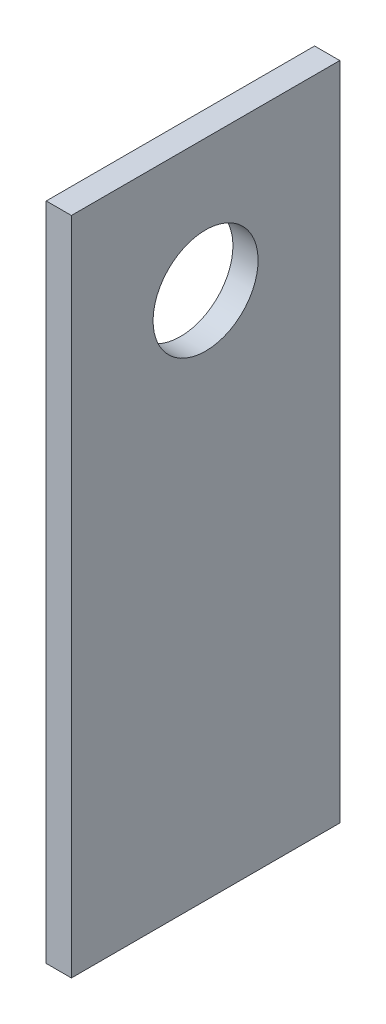
ISO-10303-21;
HEADER;
FILE_DESCRIPTION(('STEP AP214'),'2;1');
FILE_NAME('part.step','',(''),(''),'','','');
FILE_SCHEMA(('AUTOMOTIVE_DESIGN { 1 0 10303 214 1 1 1 1 }'));
ENDSEC;
DATA;
#1=APPLICATION_CONTEXT('core data for automotive mechanical design processes');
#2=APPLICATION_PROTOCOL_DEFINITION('international standard','automotive_design',2000,#1);
#3=PRODUCT_CONTEXT('',#1,'mechanical');
#4=PRODUCT('Part','Part','',(#3));
#5=PRODUCT_RELATED_PRODUCT_CATEGORY('part','',(#4));
#6=PRODUCT_DEFINITION_FORMATION('','',#4);
#7=PRODUCT_DEFINITION_CONTEXT('part definition',#1,'design');
#8=PRODUCT_DEFINITION('design','',#6,#7);
#9=PRODUCT_DEFINITION_SHAPE('','',#8);
#10=(LENGTH_UNIT() NAMED_UNIT(*) SI_UNIT(.MILLI.,.METRE.));
#11=(NAMED_UNIT(*) PLANE_ANGLE_UNIT() SI_UNIT($,.RADIAN.));
#12=(NAMED_UNIT(*) SI_UNIT($,.STERADIAN.) SOLID_ANGLE_UNIT());
#13=UNCERTAINTY_MEASURE_WITH_UNIT(LENGTH_MEASURE(1.E-05),#10,'distance_accuracy_value','');
#14=(GEOMETRIC_REPRESENTATION_CONTEXT(3) GLOBAL_UNCERTAINTY_ASSIGNED_CONTEXT((#13)) GLOBAL_UNIT_ASSIGNED_CONTEXT((#10,
#11,#12)) REPRESENTATION_CONTEXT('',''));
#15=CARTESIAN_POINT('',(0.,0.,0.));
#16=DIRECTION('',(0.,0.,1.));
#17=DIRECTION('',(1.,0.,0.));
#18=AXIS2_PLACEMENT_3D('',#15,#16,#17);
#19=CARTESIAN_POINT('',(154.497642318243,134.525,13.1975325749012));
#20=DIRECTION('',(1.,0.,0.));
#21=DIRECTION('',(0.,1.,0.));
#22=AXIS2_PLACEMENT_3D('',#19,#20,#21);
#23=PLANE('',#22);
#24=CARTESIAN_POINT('',(154.497642318243,209.525,13.1975325749012));
#25=DIRECTION('',(1.,0.,0.));
#26=DIRECTION('',(0.,1.,0.));
#27=AXIS2_PLACEMENT_3D('',#24,#25,#26);
#28=CIRCLE('',#27,19.875);
#29=CARTESIAN_POINT('',(154.497642318243,189.65,13.1975325749012));
#30=VERTEX_POINT('',#29);
#31=EDGE_CURVE('E78',#30,#30,#28,.T.);
#32=ORIENTED_EDGE('',*,*,#31,.T.);
#33=EDGE_LOOP('',(#32));
#34=FACE_BOUND('',#33,.T.);
#35=DIRECTION('',(0.,1.,0.));
#36=VECTOR('',#35,1.);
#37=CARTESIAN_POINT('',(154.497642318243,9.525,-37.6024674250988));
#38=LINE('',#37,#36);
#39=CARTESIAN_POINT('',(154.497642318243,9.525,-37.6024674250988));
#40=VERTEX_POINT('',#39);
#41=CARTESIAN_POINT('',(154.497642318243,259.525,-37.6024674250988));
#42=VERTEX_POINT('',#41);
#43=EDGE_CURVE('E20',#40,#42,#38,.T.);
#44=ORIENTED_EDGE('',*,*,#43,.F.);
#45=DIRECTION('',(0.,0.,-1.));
#46=VECTOR('',#45,1.);
#47=CARTESIAN_POINT('',(154.497642318243,9.525,63.9975325749012));
#48=LINE('',#47,#46);
#49=CARTESIAN_POINT('',(154.497642318243,9.525,63.9975325749012));
#50=VERTEX_POINT('',#49);
#51=EDGE_CURVE('E83',#50,#40,#48,.T.);
#52=ORIENTED_EDGE('',*,*,#51,.F.);
#53=DIRECTION('',(0.,-1.,0.));
#54=VECTOR('',#53,1.);
#55=CARTESIAN_POINT('',(154.497642318243,259.525,63.9975325749012));
#56=LINE('',#55,#54);
#57=CARTESIAN_POINT('',(154.497642318243,259.525,63.9975325749012));
#58=VERTEX_POINT('',#57);
#59=EDGE_CURVE('E68',#58,#50,#56,.T.);
#60=ORIENTED_EDGE('',*,*,#59,.F.);
#61=DIRECTION('',(0.,0.,1.));
#62=VECTOR('',#61,1.);
#63=CARTESIAN_POINT('',(154.497642318243,259.525,-37.6024674250988));
#64=LINE('',#63,#62);
#65=EDGE_CURVE('E102',#42,#58,#64,.T.);
#66=ORIENTED_EDGE('',*,*,#65,.F.);
#67=EDGE_LOOP('',(#44,#52,#60,#66));
#68=FACE_BOUND('',#67,.T.);
#69=ADVANCED_FACE('F16',(#34,#68),#23,.F.);
#70=CARTESIAN_POINT('',(164.022642318243,134.525,13.1975325749012));
#71=DIRECTION('',(1.,0.,0.));
#72=DIRECTION('',(0.,1.,0.));
#73=AXIS2_PLACEMENT_3D('',#70,#71,#72);
#74=PLANE('',#73);
#75=CARTESIAN_POINT('',(164.022642318243,209.525,13.1975325749012));
#76=DIRECTION('',(-1.,0.,0.));
#77=DIRECTION('',(0.,1.,0.));
#78=AXIS2_PLACEMENT_3D('',#75,#76,#77);
#79=CIRCLE('',#78,19.875);
#80=CARTESIAN_POINT('',(164.022642318243,189.65,13.1975325749012));
#81=VERTEX_POINT('',#80);
#82=EDGE_CURVE('E94',#81,#81,#79,.T.);
#83=ORIENTED_EDGE('',*,*,#82,.T.);
#84=EDGE_LOOP('',(#83));
#85=FACE_BOUND('',#84,.T.);
#86=DIRECTION('',(0.,1.,0.));
#87=VECTOR('',#86,1.);
#88=CARTESIAN_POINT('',(164.022642318243,9.525,-37.6024674250988));
#89=LINE('',#88,#87);
#90=CARTESIAN_POINT('',(164.022642318243,9.525,-37.6024674250988));
#91=VERTEX_POINT('',#90);
#92=CARTESIAN_POINT('',(164.022642318243,259.525,-37.6024674250988));
#93=VERTEX_POINT('',#92);
#94=EDGE_CURVE('E11',#91,#93,#89,.T.);
#95=ORIENTED_EDGE('',*,*,#94,.T.);
#96=DIRECTION('',(0.,0.,1.));
#97=VECTOR('',#96,1.);
#98=CARTESIAN_POINT('',(164.022642318243,259.525,-37.6024674250988));
#99=LINE('',#98,#97);
#100=CARTESIAN_POINT('',(164.022642318243,259.525,63.9975325749012));
#101=VERTEX_POINT('',#100);
#102=EDGE_CURVE('E99',#93,#101,#99,.T.);
#103=ORIENTED_EDGE('',*,*,#102,.T.);
#104=DIRECTION('',(0.,-1.,0.));
#105=VECTOR('',#104,1.);
#106=CARTESIAN_POINT('',(164.022642318243,259.525,63.9975325749012));
#107=LINE('',#106,#105);
#108=CARTESIAN_POINT('',(164.022642318243,9.525,63.9975325749012));
#109=VERTEX_POINT('',#108);
#110=EDGE_CURVE('E115',#101,#109,#107,.T.);
#111=ORIENTED_EDGE('',*,*,#110,.T.);
#112=DIRECTION('',(0.,0.,-1.));
#113=VECTOR('',#112,1.);
#114=CARTESIAN_POINT('',(164.022642318243,9.525,63.9975325749012));
#115=LINE('',#114,#113);
#116=EDGE_CURVE('E111',#109,#91,#115,.T.);
#117=ORIENTED_EDGE('',*,*,#116,.T.);
#118=EDGE_LOOP('',(#95,#103,#111,#117));
#119=FACE_BOUND('',#118,.T.);
#120=ADVANCED_FACE('F127',(#85,#119),#74,.T.);
#121=CARTESIAN_POINT('',(154.497642318243,9.525,-37.6024674250988));
#122=DIRECTION('',(0.,0.,-1.));
#123=DIRECTION('',(0.,-1.,0.));
#124=AXIS2_PLACEMENT_3D('',#121,#122,#123);
#125=PLANE('',#124);
#126=ORIENTED_EDGE('',*,*,#43,.T.);
#127=DIRECTION('',(1.,0.,0.));
#128=VECTOR('',#127,1.);
#129=CARTESIAN_POINT('',(154.497642318243,259.525,-37.6024674250988));
#130=LINE('',#129,#128);
#131=EDGE_CURVE('E101',#42,#93,#130,.T.);
#132=ORIENTED_EDGE('',*,*,#131,.T.);
#133=ORIENTED_EDGE('',*,*,#94,.F.);
#134=DIRECTION('',(1.,0.,0.));
#135=VECTOR('',#134,1.);
#136=CARTESIAN_POINT('',(154.497642318243,9.525,-37.6024674250988));
#137=LINE('',#136,#135);
#138=EDGE_CURVE('E91',#40,#91,#137,.T.);
#139=ORIENTED_EDGE('',*,*,#138,.F.);
#140=EDGE_LOOP('',(#126,#132,#133,#139));
#141=FACE_BOUND('',#140,.T.);
#142=ADVANCED_FACE('F146',(#141),#125,.T.);
#143=CARTESIAN_POINT('',(154.497642318243,259.525,-37.6024674250988));
#144=DIRECTION('',(0.,1.,0.));
#145=DIRECTION('',(1.,0.,0.));
#146=AXIS2_PLACEMENT_3D('',#143,#144,#145);
#147=PLANE('',#146);
#148=ORIENTED_EDGE('',*,*,#65,.T.);
#149=DIRECTION('',(1.,0.,0.));
#150=VECTOR('',#149,1.);
#151=CARTESIAN_POINT('',(154.497642318243,259.525,63.9975325749012));
#152=LINE('',#151,#150);
#153=EDGE_CURVE('E105',#58,#101,#152,.T.);
#154=ORIENTED_EDGE('',*,*,#153,.T.);
#155=ORIENTED_EDGE('',*,*,#102,.F.);
#156=ORIENTED_EDGE('',*,*,#131,.F.);
#157=EDGE_LOOP('',(#148,#154,#155,#156));
#158=FACE_BOUND('',#157,.T.);
#159=ADVANCED_FACE('F18',(#158),#147,.T.);
#160=CARTESIAN_POINT('',(154.497642318243,259.525,63.9975325749012));
#161=DIRECTION('',(0.,0.,1.));
#162=DIRECTION('',(1.,0.,0.));
#163=AXIS2_PLACEMENT_3D('',#160,#161,#162);
#164=PLANE('',#163);
#165=ORIENTED_EDGE('',*,*,#59,.T.);
#166=DIRECTION('',(1.,0.,0.));
#167=VECTOR('',#166,1.);
#168=CARTESIAN_POINT('',(154.497642318243,9.525,63.9975325749012));
#169=LINE('',#168,#167);
#170=EDGE_CURVE('E98',#50,#109,#169,.T.);
#171=ORIENTED_EDGE('',*,*,#170,.T.);
#172=ORIENTED_EDGE('',*,*,#110,.F.);
#173=ORIENTED_EDGE('',*,*,#153,.F.);
#174=EDGE_LOOP('',(#165,#171,#172,#173));
#175=FACE_BOUND('',#174,.T.);
#176=ADVANCED_FACE('F136',(#175),#164,.T.);
#177=CARTESIAN_POINT('',(154.497642318243,9.525,63.9975325749012));
#178=DIRECTION('',(0.,-1.,0.));
#179=DIRECTION('',(0.,0.,-1.));
#180=AXIS2_PLACEMENT_3D('',#177,#178,#179);
#181=PLANE('',#180);
#182=ORIENTED_EDGE('',*,*,#51,.T.);
#183=ORIENTED_EDGE('',*,*,#138,.T.);
#184=ORIENTED_EDGE('',*,*,#116,.F.);
#185=ORIENTED_EDGE('',*,*,#170,.F.);
#186=EDGE_LOOP('',(#182,#183,#184,#185));
#187=FACE_BOUND('',#186,.T.);
#188=ADVANCED_FACE('F130',(#187),#181,.T.);
#189=CARTESIAN_POINT('',(158.783892318243,209.525,13.1975325749012));
#190=DIRECTION('',(-1.,0.,0.));
#191=DIRECTION('',(0.,1.,0.));
#192=AXIS2_PLACEMENT_3D('',#189,#190,#191);
#193=CYLINDRICAL_SURFACE('',#192,19.875);
#194=ORIENTED_EDGE('',*,*,#82,.F.);
#195=DIRECTION('',(-1.,0.,0.));
#196=VECTOR('',#195,1.);
#197=CARTESIAN_POINT('',(158.783892318243,189.65,13.1975325749012));
#198=LINE('',#197,#196);
#199=EDGE_CURVE('E84',#81,#30,#198,.T.);
#200=ORIENTED_EDGE('',*,*,#199,.T.);
#201=ORIENTED_EDGE('',*,*,#31,.F.);
#202=ORIENTED_EDGE('',*,*,#199,.F.);
#203=EDGE_LOOP('',(#194,#200,#201,#202));
#204=FACE_BOUND('',#203,.T.);
#205=ADVANCED_FACE('F128',(#204),#193,.F.);
#206=CLOSED_SHELL('',(#69,#120,#142,#159,#176,#188,#205));
#207=MANIFOLD_SOLID_BREP('B1',#206);
#208=ADVANCED_BREP_SHAPE_REPRESENTATION('',(#18,#207),#14);
#209=SHAPE_DEFINITION_REPRESENTATION(#9,#208);
ENDSEC;
END-ISO-10303-21;
